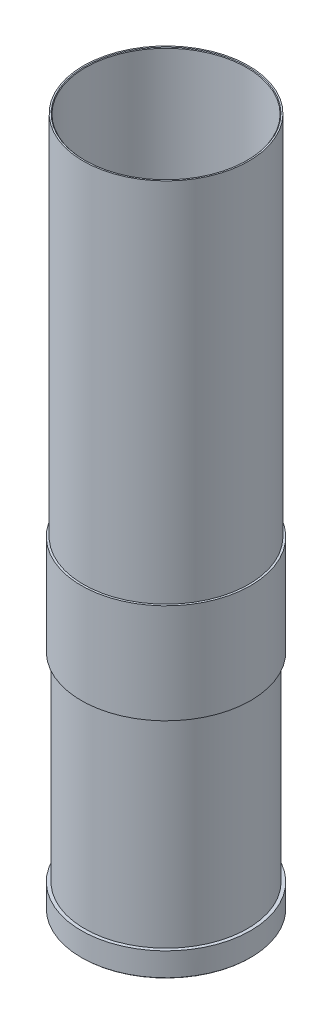
ISO-10303-21;
HEADER;
FILE_DESCRIPTION(('STEP AP214'),'2;1');
FILE_NAME('part.step','',(''),(''),'','','');
FILE_SCHEMA(('AUTOMOTIVE_DESIGN { 1 0 10303 214 1 1 1 1 }'));
ENDSEC;
DATA;
#1=APPLICATION_CONTEXT('core data for automotive mechanical design processes');
#2=APPLICATION_PROTOCOL_DEFINITION('international standard','automotive_design',2000,#1);
#3=PRODUCT_CONTEXT('',#1,'mechanical');
#4=PRODUCT('Part','Part','',(#3));
#5=PRODUCT_RELATED_PRODUCT_CATEGORY('part','',(#4));
#6=PRODUCT_DEFINITION_FORMATION('','',#4);
#7=PRODUCT_DEFINITION_CONTEXT('part definition',#1,'design');
#8=PRODUCT_DEFINITION('design','',#6,#7);
#9=PRODUCT_DEFINITION_SHAPE('','',#8);
#10=(LENGTH_UNIT() NAMED_UNIT(*) SI_UNIT(.MILLI.,.METRE.));
#11=(NAMED_UNIT(*) PLANE_ANGLE_UNIT() SI_UNIT($,.RADIAN.));
#12=(NAMED_UNIT(*) SI_UNIT($,.STERADIAN.) SOLID_ANGLE_UNIT());
#13=UNCERTAINTY_MEASURE_WITH_UNIT(LENGTH_MEASURE(1.E-05),#10,'distance_accuracy_value','');
#14=(GEOMETRIC_REPRESENTATION_CONTEXT(3) GLOBAL_UNCERTAINTY_ASSIGNED_CONTEXT((#13)) GLOBAL_UNIT_ASSIGNED_CONTEXT((#10,
#11,#12)) REPRESENTATION_CONTEXT('',''));
#15=CARTESIAN_POINT('',(0.,0.,0.));
#16=DIRECTION('',(0.,0.,1.));
#17=DIRECTION('',(1.,0.,0.));
#18=AXIS2_PLACEMENT_3D('',#15,#16,#17);
#19=CARTESIAN_POINT('',(-1.253045028398E-13,0.1499999972803,-5.953219850199E-13));
#20=DIRECTION('',(0.,1.,0.));
#21=DIRECTION('',(0.,0.,-1.));
#22=AXIS2_PLACEMENT_3D('',#19,#20,#21);
#23=CONICAL_SURFACE('',#22,42.34999999728,0.785398163397448);
#24=CARTESIAN_POINT('',(0.,0.2999999999996,0.));
#25=DIRECTION('',(0.,1.,0.));
#26=DIRECTION('',(1.,0.,0.));
#27=AXIS2_PLACEMENT_3D('',#24,#25,#26);
#28=CIRCLE('',#27,42.5);
#29=CARTESIAN_POINT('',(-1.20099753943424E-13,0.300000000000268,42.4999999999994));
#30=VERTEX_POINT('',#29);
#31=CARTESIAN_POINT('',(-42.5,0.299999999999601,0.));
#32=VERTEX_POINT('',#31);
#33=EDGE_CURVE('E28',#30,#32,#28,.T.);
#34=ORIENTED_EDGE('',*,*,#33,.F.);
#35=DIRECTION('',(0.,-0.707106781186548,-0.707106781186548));
#36=VECTOR('',#35,1.);
#37=CARTESIAN_POINT('',(-1.20118123645744E-13,0.1499999972803,42.3499999972794));
#38=LINE('',#37,#36);
#39=CARTESIAN_POINT('',(-1.20136493347398E-13,1.47677009509906E-13,42.1999999999992));
#40=VERTEX_POINT('',#39);
#41=EDGE_CURVE('E11',#30,#40,#38,.T.);
#42=ORIENTED_EDGE('',*,*,#41,.T.);
#43=CARTESIAN_POINT('',(-1.253136876906E-13,0.,-5.953219850199E-13));
#44=DIRECTION('',(0.,1.,0.));
#45=DIRECTION('',(1.,0.,0.));
#46=AXIS2_PLACEMENT_3D('',#43,#44,#45);
#47=CIRCLE('',#46,42.2);
#48=EDGE_CURVE('E146',#40,#40,#47,.T.);
#49=ORIENTED_EDGE('',*,*,#48,.T.);
#50=ORIENTED_EDGE('',*,*,#41,.F.);
#51=CARTESIAN_POINT('',(0.,0.2999999999996,0.));
#52=DIRECTION('',(0.,1.,0.));
#53=DIRECTION('',(1.,0.,0.));
#54=AXIS2_PLACEMENT_3D('',#51,#52,#53);
#55=CIRCLE('',#54,42.5);
#56=EDGE_CURVE('E131',#32,#30,#55,.T.);
#57=ORIENTED_EDGE('',*,*,#56,.F.);
#58=EDGE_LOOP('',(#34,#42,#49,#50,#57));
#59=FACE_BOUND('',#58,.T.);
#60=ADVANCED_FACE('F17',(#59),#23,.T.);
#61=CARTESIAN_POINT('',(0.,-17.3,0.));
#62=DIRECTION('',(0.,1.,0.));
#63=DIRECTION('',(1.,0.,0.));
#64=AXIS2_PLACEMENT_3D('',#61,#62,#63);
#65=CYLINDRICAL_SURFACE('',#64,42.5);
#66=CARTESIAN_POINT('',(0.,12.,0.));
#67=DIRECTION('',(0.,1.,0.));
#68=DIRECTION('',(1.,0.,0.));
#69=AXIS2_PLACEMENT_3D('',#66,#67,#68);
#70=CIRCLE('',#69,42.5);
#71=CARTESIAN_POINT('',(-42.5,12.,0.));
#72=VERTEX_POINT('',#71);
#73=EDGE_CURVE('E133',#72,#72,#70,.T.);
#74=ORIENTED_EDGE('',*,*,#73,.F.);
#75=DIRECTION('',(0.,-1.,0.));
#76=VECTOR('',#75,1.);
#77=CARTESIAN_POINT('',(-42.5,-17.3,0.));
#78=LINE('',#77,#76);
#79=EDGE_CURVE('E21',#72,#32,#78,.T.);
#80=ORIENTED_EDGE('',*,*,#79,.T.);
#81=ORIENTED_EDGE('',*,*,#56,.T.);
#82=ORIENTED_EDGE('',*,*,#33,.T.);
#83=ORIENTED_EDGE('',*,*,#79,.F.);
#84=EDGE_LOOP('',(#74,#80,#81,#82,#83));
#85=FACE_BOUND('',#84,.T.);
#86=ADVANCED_FACE('F19',(#85),#65,.T.);
#87=CARTESIAN_POINT('',(0.,12.,0.));
#88=DIRECTION('',(0.,1.,0.));
#89=DIRECTION('',(1.,0.,0.));
#90=AXIS2_PLACEMENT_3D('',#87,#88,#89);
#91=PLANE('',#90);
#92=CARTESIAN_POINT('',(0.,12.,0.));
#93=DIRECTION('',(0.,1.,0.));
#94=DIRECTION('',(1.,0.,0.));
#95=AXIS2_PLACEMENT_3D('',#92,#93,#94);
#96=CIRCLE('',#95,40.85);
#97=CARTESIAN_POINT('',(-40.85,12.,0.));
#98=VERTEX_POINT('',#97);
#99=EDGE_CURVE('E79',#98,#98,#96,.T.);
#100=ORIENTED_EDGE('',*,*,#99,.F.);
#101=EDGE_LOOP('',(#100));
#102=FACE_BOUND('',#101,.T.);
#103=ORIENTED_EDGE('',*,*,#73,.T.);
#104=EDGE_LOOP('',(#103));
#105=FACE_BOUND('',#104,.T.);
#106=ADVANCED_FACE('F201',(#102,#105),#91,.T.);
#107=CARTESIAN_POINT('',(0.,-17.3,0.));
#108=DIRECTION('',(0.,1.,0.));
#109=DIRECTION('',(1.,0.,0.));
#110=AXIS2_PLACEMENT_3D('',#107,#108,#109);
#111=CYLINDRICAL_SURFACE('',#110,40.85);
#112=CARTESIAN_POINT('',(0.,112.,0.));
#113=DIRECTION('',(0.,1.,0.));
#114=DIRECTION('',(1.,0.,0.));
#115=AXIS2_PLACEMENT_3D('',#112,#113,#114);
#116=CIRCLE('',#115,40.85);
#117=CARTESIAN_POINT('',(-40.85,112.,0.));
#118=VERTEX_POINT('',#117);
#119=EDGE_CURVE('E154',#118,#118,#116,.T.);
#120=ORIENTED_EDGE('',*,*,#119,.F.);
#121=DIRECTION('',(0.,-1.,0.));
#122=VECTOR('',#121,1.);
#123=CARTESIAN_POINT('',(-40.85,-17.3,0.));
#124=LINE('',#123,#122);
#125=EDGE_CURVE('E161',#118,#98,#124,.T.);
#126=ORIENTED_EDGE('',*,*,#125,.T.);
#127=ORIENTED_EDGE('',*,*,#99,.T.);
#128=ORIENTED_EDGE('',*,*,#125,.F.);
#129=EDGE_LOOP('',(#120,#126,#127,#128));
#130=FACE_BOUND('',#129,.T.);
#131=ADVANCED_FACE('F193',(#130),#111,.T.);
#132=CARTESIAN_POINT('',(0.,112.,0.));
#133=DIRECTION('',(0.,1.,0.));
#134=DIRECTION('',(1.,0.,0.));
#135=AXIS2_PLACEMENT_3D('',#132,#133,#134);
#136=PLANE('',#135);
#137=ORIENTED_EDGE('',*,*,#119,.T.);
#138=EDGE_LOOP('',(#137));
#139=FACE_BOUND('',#138,.T.);
#140=CARTESIAN_POINT('',(0.,112.,0.));
#141=DIRECTION('',(0.,1.,0.));
#142=DIRECTION('',(1.,0.,0.));
#143=AXIS2_PLACEMENT_3D('',#140,#141,#142);
#144=CIRCLE('',#143,42.5);
#145=CARTESIAN_POINT('',(-42.5,112.,0.));
#146=VERTEX_POINT('',#145);
#147=EDGE_CURVE('E145',#146,#146,#144,.T.);
#148=ORIENTED_EDGE('',*,*,#147,.F.);
#149=EDGE_LOOP('',(#148));
#150=FACE_BOUND('',#149,.T.);
#151=ADVANCED_FACE('F183',(#139,#150),#136,.F.);
#152=CARTESIAN_POINT('',(0.,-17.3,0.));
#153=DIRECTION('',(0.,1.,0.));
#154=DIRECTION('',(1.,0.,0.));
#155=AXIS2_PLACEMENT_3D('',#152,#153,#154);
#156=CYLINDRICAL_SURFACE('',#155,42.5);
#157=CARTESIAN_POINT('',(0.,162.,0.));
#158=DIRECTION('',(0.,1.,0.));
#159=DIRECTION('',(1.,0.,0.));
#160=AXIS2_PLACEMENT_3D('',#157,#158,#159);
#161=CIRCLE('',#160,42.5);
#162=CARTESIAN_POINT('',(-42.5,162.,0.));
#163=VERTEX_POINT('',#162);
#164=EDGE_CURVE('E138',#163,#163,#161,.T.);
#165=ORIENTED_EDGE('',*,*,#164,.F.);
#166=DIRECTION('',(0.,-1.,0.));
#167=VECTOR('',#166,1.);
#168=CARTESIAN_POINT('',(-42.5,-17.3,0.));
#169=LINE('',#168,#167);
#170=EDGE_CURVE('E141',#163,#146,#169,.T.);
#171=ORIENTED_EDGE('',*,*,#170,.T.);
#172=ORIENTED_EDGE('',*,*,#147,.T.);
#173=ORIENTED_EDGE('',*,*,#170,.F.);
#174=EDGE_LOOP('',(#165,#171,#172,#173));
#175=FACE_BOUND('',#174,.T.);
#176=ADVANCED_FACE('F181',(#175),#156,.T.);
#177=CARTESIAN_POINT('',(0.,162.,0.));
#178=DIRECTION('',(0.,1.,0.));
#179=DIRECTION('',(1.,0.,0.));
#180=AXIS2_PLACEMENT_3D('',#177,#178,#179);
#181=PLANE('',#180);
#182=CARTESIAN_POINT('',(0.,162.,0.));
#183=DIRECTION('',(0.,1.,0.));
#184=DIRECTION('',(1.,0.,0.));
#185=AXIS2_PLACEMENT_3D('',#182,#183,#184);
#186=CIRCLE('',#185,41.5);
#187=CARTESIAN_POINT('',(-41.5,162.,0.));
#188=VERTEX_POINT('',#187);
#189=EDGE_CURVE('E136',#188,#188,#186,.T.);
#190=ORIENTED_EDGE('',*,*,#189,.F.);
#191=EDGE_LOOP('',(#190));
#192=FACE_BOUND('',#191,.T.);
#193=ORIENTED_EDGE('',*,*,#164,.T.);
#194=EDGE_LOOP('',(#193));
#195=FACE_BOUND('',#194,.T.);
#196=ADVANCED_FACE('F180',(#192,#195),#181,.T.);
#197=CARTESIAN_POINT('',(0.,151.6,0.));
#198=DIRECTION('',(0.,1.,0.));
#199=DIRECTION('',(1.,0.,0.));
#200=AXIS2_PLACEMENT_3D('',#197,#198,#199);
#201=CYLINDRICAL_SURFACE('',#200,41.5);
#202=CARTESIAN_POINT('',(0.,346.,0.));
#203=DIRECTION('',(0.,1.,0.));
#204=DIRECTION('',(1.,0.,0.));
#205=AXIS2_PLACEMENT_3D('',#202,#203,#204);
#206=CIRCLE('',#205,41.5);
#207=CARTESIAN_POINT('',(-41.5,346.,0.));
#208=VERTEX_POINT('',#207);
#209=EDGE_CURVE('E152',#208,#208,#206,.T.);
#210=ORIENTED_EDGE('',*,*,#209,.F.);
#211=DIRECTION('',(0.,-1.,0.));
#212=VECTOR('',#211,1.);
#213=CARTESIAN_POINT('',(-41.5,151.6,0.));
#214=LINE('',#213,#212);
#215=EDGE_CURVE('E139',#208,#188,#214,.T.);
#216=ORIENTED_EDGE('',*,*,#215,.T.);
#217=ORIENTED_EDGE('',*,*,#189,.T.);
#218=ORIENTED_EDGE('',*,*,#215,.F.);
#219=EDGE_LOOP('',(#210,#216,#217,#218));
#220=FACE_BOUND('',#219,.T.);
#221=ADVANCED_FACE('F190',(#220),#201,.T.);
#222=CARTESIAN_POINT('',(0.,346.,0.));
#223=DIRECTION('',(0.,1.,0.));
#224=DIRECTION('',(1.,0.,0.));
#225=AXIS2_PLACEMENT_3D('',#222,#223,#224);
#226=PLANE('',#225);
#227=CARTESIAN_POINT('',(0.,346.,5.484862269567E-13));
#228=DIRECTION('',(0.,1.,0.));
#229=DIRECTION('',(1.,0.,0.));
#230=AXIS2_PLACEMENT_3D('',#227,#228,#229);
#231=CIRCLE('',#230,40.8);
#232=CARTESIAN_POINT('',(0.,346.000000000015,40.7999999999855));
#233=VERTEX_POINT('',#232);
#234=EDGE_CURVE('E114',#233,#233,#231,.T.);
#235=ORIENTED_EDGE('',*,*,#234,.F.);
#236=EDGE_LOOP('',(#235));
#237=FACE_BOUND('',#236,.T.);
#238=ORIENTED_EDGE('',*,*,#209,.T.);
#239=EDGE_LOOP('',(#238));
#240=FACE_BOUND('',#239,.T.);
#241=ADVANCED_FACE('F203',(#237,#240),#226,.T.);
#242=CARTESIAN_POINT('',(0.,345.8499999969,5.484862269567E-13));
#243=DIRECTION('',(0.,1.,0.));
#244=DIRECTION('',(0.,0.,-1.));
#245=AXIS2_PLACEMENT_3D('',#242,#243,#244);
#246=CONICAL_SURFACE('',#245,40.64999999687,0.785398163397448);
#247=CARTESIAN_POINT('',(0.,345.7,0.));
#248=DIRECTION('',(0.,1.,0.));
#249=DIRECTION('',(1.,0.,0.));
#250=AXIS2_PLACEMENT_3D('',#247,#248,#249);
#251=CIRCLE('',#250,40.5);
#252=CARTESIAN_POINT('',(0.,345.700000000015,40.4999999999852));
#253=VERTEX_POINT('',#252);
#254=CARTESIAN_POINT('',(-40.5,345.7,0.));
#255=VERTEX_POINT('',#254);
#256=EDGE_CURVE('E116',#253,#255,#251,.T.);
#257=ORIENTED_EDGE('',*,*,#256,.F.);
#258=DIRECTION('',(0.,0.707106781186548,0.707106781186548));
#259=VECTOR('',#258,1.);
#260=CARTESIAN_POINT('',(0.,345.8499999969,40.6499999968705));
#261=LINE('',#260,#259);
#262=EDGE_CURVE('E108',#253,#233,#261,.T.);
#263=ORIENTED_EDGE('',*,*,#262,.T.);
#264=ORIENTED_EDGE('',*,*,#234,.T.);
#265=ORIENTED_EDGE('',*,*,#262,.F.);
#266=CARTESIAN_POINT('',(0.,345.7,0.));
#267=DIRECTION('',(0.,1.,0.));
#268=DIRECTION('',(1.,0.,0.));
#269=AXIS2_PLACEMENT_3D('',#266,#267,#268);
#270=CIRCLE('',#269,40.5);
#271=EDGE_CURVE('E112',#255,#253,#270,.T.);
#272=ORIENTED_EDGE('',*,*,#271,.F.);
#273=EDGE_LOOP('',(#257,#263,#264,#265,#272));
#274=FACE_BOUND('',#273,.T.);
#275=ADVANCED_FACE('F110',(#274),#246,.F.);
#276=CARTESIAN_POINT('',(0.,-17.3,0.));
#277=DIRECTION('',(0.,1.,0.));
#278=DIRECTION('',(1.,0.,0.));
#279=AXIS2_PLACEMENT_3D('',#276,#277,#278);
#280=CYLINDRICAL_SURFACE('',#279,40.5);
#281=CARTESIAN_POINT('',(0.,0.,0.));
#282=DIRECTION('',(0.,1.,0.));
#283=DIRECTION('',(1.,0.,0.));
#284=AXIS2_PLACEMENT_3D('',#281,#282,#283);
#285=CIRCLE('',#284,40.5);
#286=CARTESIAN_POINT('',(-40.5,0.,0.));
#287=VERTEX_POINT('',#286);
#288=EDGE_CURVE('E127',#287,#287,#285,.T.);
#289=ORIENTED_EDGE('',*,*,#288,.F.);
#290=DIRECTION('',(0.,1.,0.));
#291=VECTOR('',#290,1.);
#292=CARTESIAN_POINT('',(-40.5,-17.3,0.));
#293=LINE('',#292,#291);
#294=EDGE_CURVE('E94',#287,#255,#293,.T.);
#295=ORIENTED_EDGE('',*,*,#294,.T.);
#296=ORIENTED_EDGE('',*,*,#271,.T.);
#297=ORIENTED_EDGE('',*,*,#256,.T.);
#298=ORIENTED_EDGE('',*,*,#294,.F.);
#299=EDGE_LOOP('',(#289,#295,#296,#297,#298));
#300=FACE_BOUND('',#299,.T.);
#301=ADVANCED_FACE('F120',(#300),#280,.F.);
#302=CARTESIAN_POINT('',(0.,0.,0.));
#303=DIRECTION('',(0.,1.,0.));
#304=DIRECTION('',(1.,0.,0.));
#305=AXIS2_PLACEMENT_3D('',#302,#303,#304);
#306=PLANE('',#305);
#307=ORIENTED_EDGE('',*,*,#288,.T.);
#308=EDGE_LOOP('',(#307));
#309=FACE_BOUND('',#308,.T.);
#310=ORIENTED_EDGE('',*,*,#48,.F.);
#311=EDGE_LOOP('',(#310));
#312=FACE_BOUND('',#311,.T.);
#313=ADVANCED_FACE('F208',(#309,#312),#306,.F.);
#314=CLOSED_SHELL('',(#60,#86,#106,#131,#151,#176,#196,#221,#241,#275,#301,#313));
#315=MANIFOLD_SOLID_BREP('B1',#314);
#316=ADVANCED_BREP_SHAPE_REPRESENTATION('',(#18,#315),#14);
#317=SHAPE_DEFINITION_REPRESENTATION(#9,#316);
ENDSEC;
END-ISO-10303-21;
